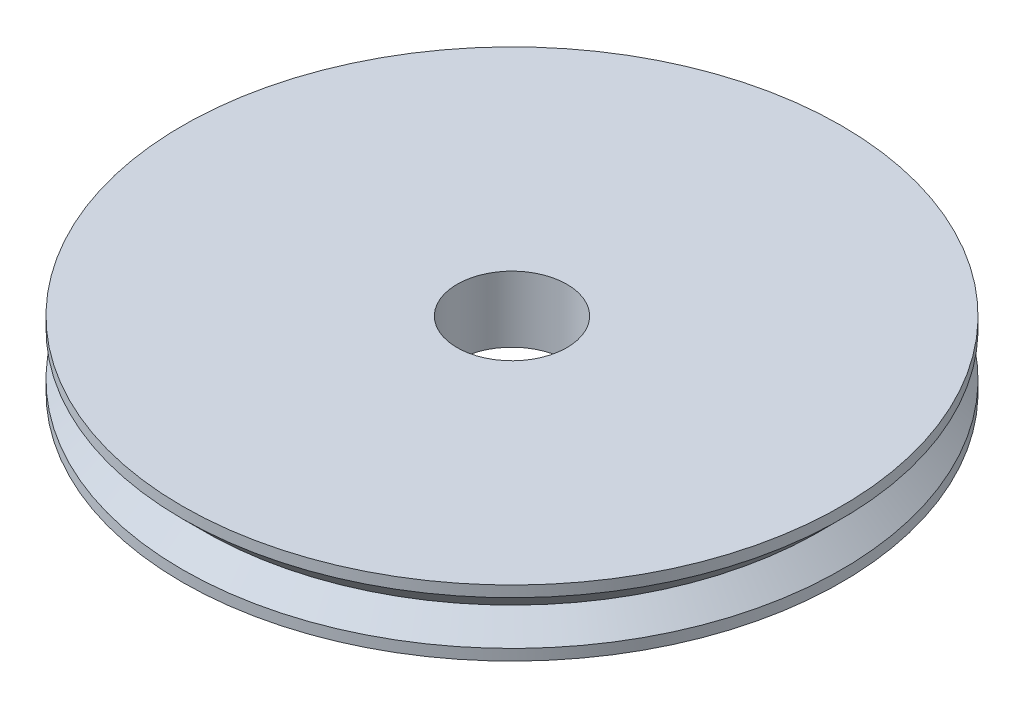
ISO-10303-21;
HEADER;
FILE_DESCRIPTION(('STEP AP214'),'2;1');
FILE_NAME('part.step','',(''),(''),'','','');
FILE_SCHEMA(('AUTOMOTIVE_DESIGN { 1 0 10303 214 1 1 1 1 }'));
ENDSEC;
DATA;
#1=APPLICATION_CONTEXT('core data for automotive mechanical design processes');
#2=APPLICATION_PROTOCOL_DEFINITION('international standard','automotive_design',2000,#1);
#3=PRODUCT_CONTEXT('',#1,'mechanical');
#4=PRODUCT('Part','Part','',(#3));
#5=PRODUCT_RELATED_PRODUCT_CATEGORY('part','',(#4));
#6=PRODUCT_DEFINITION_FORMATION('','',#4);
#7=PRODUCT_DEFINITION_CONTEXT('part definition',#1,'design');
#8=PRODUCT_DEFINITION('design','',#6,#7);
#9=PRODUCT_DEFINITION_SHAPE('','',#8);
#10=(LENGTH_UNIT() NAMED_UNIT(*) SI_UNIT(.MILLI.,.METRE.));
#11=(NAMED_UNIT(*) PLANE_ANGLE_UNIT() SI_UNIT($,.RADIAN.));
#12=(NAMED_UNIT(*) SI_UNIT($,.STERADIAN.) SOLID_ANGLE_UNIT());
#13=UNCERTAINTY_MEASURE_WITH_UNIT(LENGTH_MEASURE(1.E-05),#10,'distance_accuracy_value','');
#14=(GEOMETRIC_REPRESENTATION_CONTEXT(3) GLOBAL_UNCERTAINTY_ASSIGNED_CONTEXT((#13)) GLOBAL_UNIT_ASSIGNED_CONTEXT((#10,
#11,#12)) REPRESENTATION_CONTEXT('',''));
#15=CARTESIAN_POINT('',(0.,0.,0.));
#16=DIRECTION('',(0.,0.,1.));
#17=DIRECTION('',(1.,0.,0.));
#18=AXIS2_PLACEMENT_3D('',#15,#16,#17);
#19=CARTESIAN_POINT('',(-2.5,0.,0.));
#20=DIRECTION('',(0.,1.,0.));
#21=DIRECTION('',(0.,0.,1.));
#22=AXIS2_PLACEMENT_3D('',#19,#20,#21);
#23=PLANE('',#22);
#24=CARTESIAN_POINT('',(0.,0.,0.));
#25=DIRECTION('',(0.,-1.,0.));
#26=DIRECTION('',(0.,0.,-1.));
#27=AXIS2_PLACEMENT_3D('',#24,#25,#26);
#28=CIRCLE('',#27,2.5);
#29=CARTESIAN_POINT('',(0.,0.,-2.5));
#30=VERTEX_POINT('',#29);
#31=EDGE_CURVE('E10',#30,#30,#28,.T.);
#32=ORIENTED_EDGE('',*,*,#31,.F.);
#33=EDGE_LOOP('',(#32));
#34=FACE_BOUND('',#33,.T.);
#35=CARTESIAN_POINT('',(0.,0.,0.));
#36=DIRECTION('',(0.,-1.,0.));
#37=DIRECTION('',(0.,0.,-1.));
#38=AXIS2_PLACEMENT_3D('',#35,#36,#37);
#39=CIRCLE('',#38,15.);
#40=CARTESIAN_POINT('',(0.,0.,-15.));
#41=VERTEX_POINT('',#40);
#42=EDGE_CURVE('E68',#41,#41,#39,.T.);
#43=ORIENTED_EDGE('',*,*,#42,.T.);
#44=EDGE_LOOP('',(#43));
#45=FACE_BOUND('',#44,.T.);
#46=ADVANCED_FACE('F37',(#34,#45),#23,.F.);
#47=CARTESIAN_POINT('',(0.,0.,0.));
#48=DIRECTION('',(0.,-1.,0.));
#49=DIRECTION('',(0.,0.,-1.));
#50=AXIS2_PLACEMENT_3D('',#47,#48,#49);
#51=CYLINDRICAL_SURFACE('',#50,2.5);
#52=CARTESIAN_POINT('',(0.,3.,0.));
#53=DIRECTION('',(0.,-1.,0.));
#54=DIRECTION('',(0.,0.,-1.));
#55=AXIS2_PLACEMENT_3D('',#52,#53,#54);
#56=CIRCLE('',#55,2.5);
#57=CARTESIAN_POINT('',(0.,3.,-2.5));
#58=VERTEX_POINT('',#57);
#59=EDGE_CURVE('E44',#58,#58,#56,.T.);
#60=ORIENTED_EDGE('',*,*,#59,.F.);
#61=EDGE_LOOP('',(#60));
#62=FACE_BOUND('',#61,.T.);
#63=ORIENTED_EDGE('',*,*,#31,.T.);
#64=EDGE_LOOP('',(#63));
#65=FACE_BOUND('',#64,.T.);
#66=ADVANCED_FACE('F100',(#62,#65),#51,.F.);
#67=CARTESIAN_POINT('',(-2.5,3.,0.));
#68=DIRECTION('',(0.,-1.,0.));
#69=DIRECTION('',(0.,0.,-1.));
#70=AXIS2_PLACEMENT_3D('',#67,#68,#69);
#71=PLANE('',#70);
#72=CARTESIAN_POINT('',(0.,3.,0.));
#73=DIRECTION('',(0.,-1.,0.));
#74=DIRECTION('',(0.,0.,-1.));
#75=AXIS2_PLACEMENT_3D('',#72,#73,#74);
#76=CIRCLE('',#75,15.);
#77=CARTESIAN_POINT('',(0.,3.,-15.));
#78=VERTEX_POINT('',#77);
#79=EDGE_CURVE('E49',#78,#78,#76,.T.);
#80=ORIENTED_EDGE('',*,*,#79,.F.);
#81=EDGE_LOOP('',(#80));
#82=FACE_BOUND('',#81,.T.);
#83=ORIENTED_EDGE('',*,*,#59,.T.);
#84=EDGE_LOOP('',(#83));
#85=FACE_BOUND('',#84,.T.);
#86=ADVANCED_FACE('F95',(#82,#85),#71,.F.);
#87=CARTESIAN_POINT('',(0.,0.,0.));
#88=DIRECTION('',(0.,-1.,0.));
#89=DIRECTION('',(0.,0.,-1.));
#90=AXIS2_PLACEMENT_3D('',#87,#88,#89);
#91=CYLINDRICAL_SURFACE('',#90,15.);
#92=CARTESIAN_POINT('',(0.,2.5,0.));
#93=DIRECTION('',(0.,-1.,0.));
#94=DIRECTION('',(0.,0.,-1.));
#95=AXIS2_PLACEMENT_3D('',#92,#93,#94);
#96=CIRCLE('',#95,15.);
#97=CARTESIAN_POINT('',(0.,2.5,-15.));
#98=VERTEX_POINT('',#97);
#99=EDGE_CURVE('E54',#98,#98,#96,.T.);
#100=ORIENTED_EDGE('',*,*,#99,.F.);
#101=EDGE_LOOP('',(#100));
#102=FACE_BOUND('',#101,.T.);
#103=ORIENTED_EDGE('',*,*,#79,.T.);
#104=EDGE_LOOP('',(#103));
#105=FACE_BOUND('',#104,.T.);
#106=ADVANCED_FACE('F89',(#102,#105),#91,.T.);
#107=CARTESIAN_POINT('',(0.,2.5,0.));
#108=DIRECTION('',(0.,1.,0.));
#109=DIRECTION('',(0.,0.,1.));
#110=AXIS2_PLACEMENT_3D('',#107,#108,#109);
#111=CONICAL_SURFACE('',#110,15.,0.785398163397449);
#112=CARTESIAN_POINT('',(0.,1.5,0.));
#113=DIRECTION('',(0.,-1.,0.));
#114=DIRECTION('',(0.,0.,-1.));
#115=AXIS2_PLACEMENT_3D('',#112,#113,#114);
#116=CIRCLE('',#115,14.);
#117=CARTESIAN_POINT('',(0.,1.5,-14.));
#118=VERTEX_POINT('',#117);
#119=EDGE_CURVE('E60',#118,#118,#116,.T.);
#120=ORIENTED_EDGE('',*,*,#119,.F.);
#121=EDGE_LOOP('',(#120));
#122=FACE_BOUND('',#121,.T.);
#123=ORIENTED_EDGE('',*,*,#99,.T.);
#124=EDGE_LOOP('',(#123));
#125=FACE_BOUND('',#124,.T.);
#126=ADVANCED_FACE('F83',(#122,#125),#111,.T.);
#127=CARTESIAN_POINT('',(0.,1.5,0.));
#128=DIRECTION('',(0.,-1.,0.));
#129=DIRECTION('',(0.,0.,-1.));
#130=AXIS2_PLACEMENT_3D('',#127,#128,#129);
#131=CONICAL_SURFACE('',#130,14.,0.785398163397449);
#132=CARTESIAN_POINT('',(0.,0.499999999999999,0.));
#133=DIRECTION('',(0.,-1.,0.));
#134=DIRECTION('',(0.,0.,-1.));
#135=AXIS2_PLACEMENT_3D('',#132,#133,#134);
#136=CIRCLE('',#135,15.);
#137=CARTESIAN_POINT('',(0.,0.499999999999999,-15.));
#138=VERTEX_POINT('',#137);
#139=EDGE_CURVE('E64',#138,#138,#136,.T.);
#140=ORIENTED_EDGE('',*,*,#139,.F.);
#141=EDGE_LOOP('',(#140));
#142=FACE_BOUND('',#141,.T.);
#143=ORIENTED_EDGE('',*,*,#119,.T.);
#144=EDGE_LOOP('',(#143));
#145=FACE_BOUND('',#144,.T.);
#146=ADVANCED_FACE('F77',(#142,#145),#131,.T.);
#147=CARTESIAN_POINT('',(0.,0.,0.));
#148=DIRECTION('',(0.,-1.,0.));
#149=DIRECTION('',(0.,0.,-1.));
#150=AXIS2_PLACEMENT_3D('',#147,#148,#149);
#151=CYLINDRICAL_SURFACE('',#150,15.);
#152=ORIENTED_EDGE('',*,*,#42,.F.);
#153=EDGE_LOOP('',(#152));
#154=FACE_BOUND('',#153,.T.);
#155=ORIENTED_EDGE('',*,*,#139,.T.);
#156=EDGE_LOOP('',(#155));
#157=FACE_BOUND('',#156,.T.);
#158=ADVANCED_FACE('F74',(#154,#157),#151,.T.);
#159=CLOSED_SHELL('',(#46,#66,#86,#106,#126,#146,#158));
#160=MANIFOLD_SOLID_BREP('B2',#159);
#161=ADVANCED_BREP_SHAPE_REPRESENTATION('',(#18,#160),#14);
#162=SHAPE_DEFINITION_REPRESENTATION(#9,#161);
ENDSEC;
END-ISO-10303-21;
